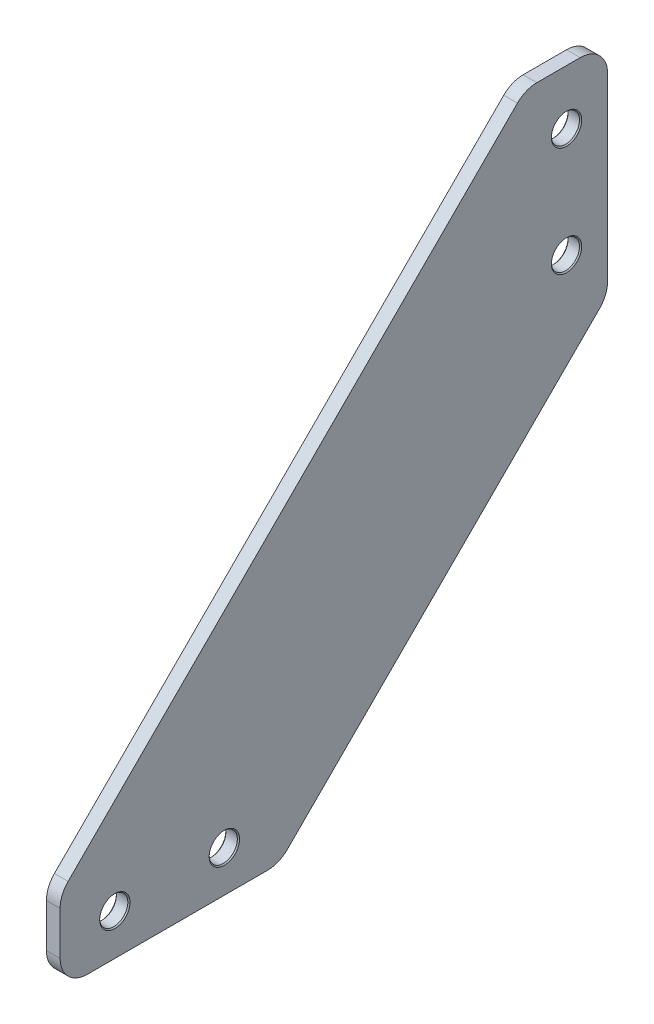
ISO-10303-21;
HEADER;
FILE_DESCRIPTION(('STEP AP214'),'2;1');
FILE_NAME('part.step','',(''),(''),'','','');
FILE_SCHEMA(('AUTOMOTIVE_DESIGN { 1 0 10303 214 1 1 1 1 }'));
ENDSEC;
DATA;
#1=APPLICATION_CONTEXT('core data for automotive mechanical design processes');
#2=APPLICATION_PROTOCOL_DEFINITION('international standard','automotive_design',2000,#1);
#3=PRODUCT_CONTEXT('',#1,'mechanical');
#4=PRODUCT('Part','Part','',(#3));
#5=PRODUCT_RELATED_PRODUCT_CATEGORY('part','',(#4));
#6=PRODUCT_DEFINITION_FORMATION('','',#4);
#7=PRODUCT_DEFINITION_CONTEXT('part definition',#1,'design');
#8=PRODUCT_DEFINITION('design','',#6,#7);
#9=PRODUCT_DEFINITION_SHAPE('','',#8);
#10=(LENGTH_UNIT() NAMED_UNIT(*) SI_UNIT(.MILLI.,.METRE.));
#11=(NAMED_UNIT(*) PLANE_ANGLE_UNIT() SI_UNIT($,.RADIAN.));
#12=(NAMED_UNIT(*) SI_UNIT($,.STERADIAN.) SOLID_ANGLE_UNIT());
#13=UNCERTAINTY_MEASURE_WITH_UNIT(LENGTH_MEASURE(1.E-05),#10,'distance_accuracy_value','');
#14=(GEOMETRIC_REPRESENTATION_CONTEXT(3) GLOBAL_UNCERTAINTY_ASSIGNED_CONTEXT((#13)) GLOBAL_UNIT_ASSIGNED_CONTEXT((#10,
#11,#12)) REPRESENTATION_CONTEXT('',''));
#15=CARTESIAN_POINT('',(0.,0.,0.));
#16=DIRECTION('',(0.,0.,1.));
#17=DIRECTION('',(1.,0.,0.));
#18=AXIS2_PLACEMENT_3D('',#15,#16,#17);
#19=CARTESIAN_POINT('',(1.5875,76.2000000000003,0.));
#20=DIRECTION('',(0.,0.,1.));
#21=DIRECTION('',(0.,-1.,0.));
#22=AXIS2_PLACEMENT_3D('',#19,#20,#21);
#23=PLANE('',#22);
#24=DIRECTION('',(0.,1.,0.));
#25=VECTOR('',#24,1.);
#26=CARTESIAN_POINT('',(1.5875,76.2000000000003,0.));
#27=LINE('',#26,#25);
#28=CARTESIAN_POINT('',(1.5875,78.8302561210695,0.));
#29=VERTEX_POINT('',#28);
#30=CARTESIAN_POINT('',(1.5875,120.65,0.));
#31=VERTEX_POINT('',#30);
#32=EDGE_CURVE('E150',#29,#31,#27,.T.);
#33=ORIENTED_EDGE('',*,*,#32,.F.);
#34=DIRECTION('',(-1.,0.,0.));
#35=VECTOR('',#34,1.);
#36=CARTESIAN_POINT('',(1.5875,78.8302561210695,0.));
#37=LINE('',#36,#35);
#38=CARTESIAN_POINT('',(-1.5875,78.8302561210695,0.));
#39=VERTEX_POINT('',#38);
#40=EDGE_CURVE('E135',#29,#39,#37,.T.);
#41=ORIENTED_EDGE('',*,*,#40,.T.);
#42=DIRECTION('',(0.,1.,0.));
#43=VECTOR('',#42,1.);
#44=CARTESIAN_POINT('',(-1.5875,76.2000000000003,0.));
#45=LINE('',#44,#43);
#46=CARTESIAN_POINT('',(-1.5875,120.65,0.));
#47=VERTEX_POINT('',#46);
#48=EDGE_CURVE('E147',#39,#47,#45,.T.);
#49=ORIENTED_EDGE('',*,*,#48,.T.);
#50=DIRECTION('',(-1.,0.,0.));
#51=VECTOR('',#50,1.);
#52=CARTESIAN_POINT('',(1.5875,120.65,0.));
#53=LINE('',#52,#51);
#54=EDGE_CURVE('E152',#47,#31,#53,.F.);
#55=ORIENTED_EDGE('',*,*,#54,.T.);
#56=EDGE_LOOP('',(#33,#41,#49,#55));
#57=FACE_BOUND('',#56,.T.);
#58=ADVANCED_FACE('F39',(#57),#23,.F.);
#59=CARTESIAN_POINT('',(1.5875,127.,0.));
#60=DIRECTION('',(0.,-1.,0.));
#61=DIRECTION('',(0.,0.,-1.));
#62=AXIS2_PLACEMENT_3D('',#59,#60,#61);
#63=PLANE('',#62);
#64=DIRECTION('',(0.,0.,1.));
#65=VECTOR('',#64,1.);
#66=CARTESIAN_POINT('',(1.5875,127.,0.));
#67=LINE('',#66,#65);
#68=CARTESIAN_POINT('',(1.5875,127.,6.35));
#69=VERTEX_POINT('',#68);
#70=CARTESIAN_POINT('',(1.5875,127.,16.4197438789308));
#71=VERTEX_POINT('',#70);
#72=EDGE_CURVE('E608',#69,#71,#67,.T.);
#73=ORIENTED_EDGE('',*,*,#72,.F.);
#74=DIRECTION('',(-1.,0.,0.));
#75=VECTOR('',#74,1.);
#76=CARTESIAN_POINT('',(1.5875,127.,6.35));
#77=LINE('',#76,#75);
#78=CARTESIAN_POINT('',(-1.5875,127.,6.35));
#79=VERTEX_POINT('',#78);
#80=EDGE_CURVE('E199',#69,#79,#77,.T.);
#81=ORIENTED_EDGE('',*,*,#80,.T.);
#82=DIRECTION('',(0.,0.,1.));
#83=VECTOR('',#82,1.);
#84=CARTESIAN_POINT('',(-1.5875,127.,0.));
#85=LINE('',#84,#83);
#86=CARTESIAN_POINT('',(-1.5875,127.,16.4197438789308));
#87=VERTEX_POINT('',#86);
#88=EDGE_CURVE('E156',#79,#87,#85,.T.);
#89=ORIENTED_EDGE('',*,*,#88,.T.);
#90=DIRECTION('',(-1.,0.,0.));
#91=VECTOR('',#90,1.);
#92=CARTESIAN_POINT('',(1.5875,127.,16.4197438789308));
#93=LINE('',#92,#91);
#94=EDGE_CURVE('E197',#87,#71,#93,.F.);
#95=ORIENTED_EDGE('',*,*,#94,.T.);
#96=EDGE_LOOP('',(#73,#81,#89,#95));
#97=FACE_BOUND('',#96,.T.);
#98=ADVANCED_FACE('F285',(#97),#63,.F.);
#99=CARTESIAN_POINT('',(1.5875,127.,19.05));
#100=DIRECTION('',(0.,-0.707106781186546,-0.707106781186549));
#101=DIRECTION('',(0.,0.707106781186549,-0.707106781186546));
#102=AXIS2_PLACEMENT_3D('',#99,#100,#101);
#103=PLANE('',#102);
#104=DIRECTION('',(0.,-0.707106781186549,0.707106781186546));
#105=VECTOR('',#104,1.);
#106=CARTESIAN_POINT('',(1.5875,127.,19.05));
#107=LINE('',#106,#105);
#108=CARTESIAN_POINT('',(1.5875,125.140128060535,20.9098719394654));
#109=VERTEX_POINT('',#108);
#110=CARTESIAN_POINT('',(1.5875,20.9098719394654,125.140128060535));
#111=VERTEX_POINT('',#110);
#112=EDGE_CURVE('E602',#109,#111,#107,.T.);
#113=ORIENTED_EDGE('',*,*,#112,.F.);
#114=DIRECTION('',(-1.,0.,0.));
#115=VECTOR('',#114,1.);
#116=CARTESIAN_POINT('',(1.5875,125.140128060535,20.9098719394654));
#117=LINE('',#116,#115);
#118=CARTESIAN_POINT('',(-1.5875,125.140128060535,20.9098719394654));
#119=VERTEX_POINT('',#118);
#120=EDGE_CURVE('E204',#109,#119,#117,.T.);
#121=ORIENTED_EDGE('',*,*,#120,.T.);
#122=DIRECTION('',(0.,-0.707106781186549,0.707106781186546));
#123=VECTOR('',#122,1.);
#124=CARTESIAN_POINT('',(-1.5875,127.,19.05));
#125=LINE('',#124,#123);
#126=CARTESIAN_POINT('',(-1.5875,20.9098719394654,125.140128060535));
#127=VERTEX_POINT('',#126);
#128=EDGE_CURVE('E159',#119,#127,#125,.T.);
#129=ORIENTED_EDGE('',*,*,#128,.T.);
#130=DIRECTION('',(-1.,0.,0.));
#131=VECTOR('',#130,1.);
#132=CARTESIAN_POINT('',(1.5875,20.9098719394654,125.140128060535));
#133=LINE('',#132,#131);
#134=EDGE_CURVE('E202',#127,#111,#133,.F.);
#135=ORIENTED_EDGE('',*,*,#134,.T.);
#136=EDGE_LOOP('',(#113,#121,#129,#135));
#137=FACE_BOUND('',#136,.T.);
#138=ADVANCED_FACE('F290',(#137),#103,.F.);
#139=CARTESIAN_POINT('',(1.5875,19.05,127.));
#140=DIRECTION('',(0.,0.,-1.));
#141=DIRECTION('',(-1.,0.,0.));
#142=AXIS2_PLACEMENT_3D('',#139,#140,#141);
#143=PLANE('',#142);
#144=DIRECTION('',(0.,-1.,0.));
#145=VECTOR('',#144,1.);
#146=CARTESIAN_POINT('',(1.5875,19.05,127.));
#147=LINE('',#146,#145);
#148=CARTESIAN_POINT('',(1.5875,16.4197438789308,127.));
#149=VERTEX_POINT('',#148);
#150=CARTESIAN_POINT('',(1.5875,6.35,127.));
#151=VERTEX_POINT('',#150);
#152=EDGE_CURVE('E607',#149,#151,#147,.T.);
#153=ORIENTED_EDGE('',*,*,#152,.F.);
#154=DIRECTION('',(-1.,0.,0.));
#155=VECTOR('',#154,1.);
#156=CARTESIAN_POINT('',(1.5875,16.4197438789308,127.));
#157=LINE('',#156,#155);
#158=CARTESIAN_POINT('',(-1.5875,16.4197438789308,127.));
#159=VERTEX_POINT('',#158);
#160=EDGE_CURVE('E209',#149,#159,#157,.T.);
#161=ORIENTED_EDGE('',*,*,#160,.T.);
#162=DIRECTION('',(0.,-1.,0.));
#163=VECTOR('',#162,1.);
#164=CARTESIAN_POINT('',(-1.5875,19.05,127.));
#165=LINE('',#164,#163);
#166=CARTESIAN_POINT('',(-1.5875,6.35,127.));
#167=VERTEX_POINT('',#166);
#168=EDGE_CURVE('E167',#159,#167,#165,.T.);
#169=ORIENTED_EDGE('',*,*,#168,.T.);
#170=DIRECTION('',(-1.,0.,0.));
#171=VECTOR('',#170,1.);
#172=CARTESIAN_POINT('',(1.5875,6.35,127.));
#173=LINE('',#172,#171);
#174=EDGE_CURVE('E207',#167,#151,#173,.F.);
#175=ORIENTED_EDGE('',*,*,#174,.T.);
#176=EDGE_LOOP('',(#153,#161,#169,#175));
#177=FACE_BOUND('',#176,.T.);
#178=ADVANCED_FACE('F471',(#177),#143,.F.);
#179=CARTESIAN_POINT('',(1.5875,0.,127.));
#180=DIRECTION('',(0.,1.,0.));
#181=DIRECTION('',(0.,0.,1.));
#182=AXIS2_PLACEMENT_3D('',#179,#180,#181);
#183=PLANE('',#182);
#184=DIRECTION('',(0.,0.,-1.));
#185=VECTOR('',#184,1.);
#186=CARTESIAN_POINT('',(-1.5875,0.,127.));
#187=LINE('',#186,#185);
#188=CARTESIAN_POINT('',(-1.5875,0.,120.65));
#189=VERTEX_POINT('',#188);
#190=CARTESIAN_POINT('',(-1.5875,0.,78.8302561210692));
#191=VERTEX_POINT('',#190);
#192=EDGE_CURVE('E170',#189,#191,#187,.T.);
#193=ORIENTED_EDGE('',*,*,#192,.T.);
#194=DIRECTION('',(-1.,0.,0.));
#195=VECTOR('',#194,1.);
#196=CARTESIAN_POINT('',(1.5875,0.,78.8302561210692));
#197=LINE('',#196,#195);
#198=CARTESIAN_POINT('',(1.5875,0.,78.8302561210692));
#199=VERTEX_POINT('',#198);
#200=EDGE_CURVE('E55',#191,#199,#197,.F.);
#201=ORIENTED_EDGE('',*,*,#200,.T.);
#202=DIRECTION('',(0.,0.,-1.));
#203=VECTOR('',#202,1.);
#204=CARTESIAN_POINT('',(1.5875,0.,127.));
#205=LINE('',#204,#203);
#206=CARTESIAN_POINT('',(1.5875,0.,120.65));
#207=VERTEX_POINT('',#206);
#208=EDGE_CURVE('E620',#207,#199,#205,.T.);
#209=ORIENTED_EDGE('',*,*,#208,.F.);
#210=DIRECTION('',(-1.,0.,0.));
#211=VECTOR('',#210,1.);
#212=CARTESIAN_POINT('',(1.5875,0.,120.65));
#213=LINE('',#212,#211);
#214=EDGE_CURVE('E212',#207,#189,#213,.T.);
#215=ORIENTED_EDGE('',*,*,#214,.T.);
#216=EDGE_LOOP('',(#193,#201,#209,#215));
#217=FACE_BOUND('',#216,.T.);
#218=ADVANCED_FACE('F461',(#217),#183,.F.);
#219=CARTESIAN_POINT('',(1.5875,0.,76.2));
#220=DIRECTION('',(0.,0.707106781186546,0.707106781186549));
#221=DIRECTION('',(0.,-0.707106781186549,0.707106781186546));
#222=AXIS2_PLACEMENT_3D('',#219,#220,#221);
#223=PLANE('',#222);
#224=DIRECTION('',(0.,0.707106781186549,-0.707106781186546));
#225=VECTOR('',#224,1.);
#226=CARTESIAN_POINT('',(-1.5875,0.,76.2));
#227=LINE('',#226,#225);
#228=CARTESIAN_POINT('',(-1.5875,1.85987193946543,74.3401280605346));
#229=VERTEX_POINT('',#228);
#230=CARTESIAN_POINT('',(-1.5875,74.3401280605349,1.85987193946542));
#231=VERTEX_POINT('',#230);
#232=EDGE_CURVE('E172',#229,#231,#227,.T.);
#233=ORIENTED_EDGE('',*,*,#232,.T.);
#234=DIRECTION('',(-1.,0.,0.));
#235=VECTOR('',#234,1.);
#236=CARTESIAN_POINT('',(1.5875,74.3401280605349,1.85987193946542));
#237=LINE('',#236,#235);
#238=CARTESIAN_POINT('',(1.5875,74.3401280605349,1.85987193946542));
#239=VERTEX_POINT('',#238);
#240=EDGE_CURVE('E136',#231,#239,#237,.F.);
#241=ORIENTED_EDGE('',*,*,#240,.T.);
#242=DIRECTION('',(0.,0.707106781186549,-0.707106781186546));
#243=VECTOR('',#242,1.);
#244=CARTESIAN_POINT('',(1.5875,0.,76.2));
#245=LINE('',#244,#243);
#246=CARTESIAN_POINT('',(1.5875,1.85987193946543,74.3401280605346));
#247=VERTEX_POINT('',#246);
#248=EDGE_CURVE('E162',#247,#239,#245,.T.);
#249=ORIENTED_EDGE('',*,*,#248,.F.);
#250=DIRECTION('',(-1.,0.,0.));
#251=VECTOR('',#250,1.);
#252=CARTESIAN_POINT('',(1.5875,1.85987193946543,74.3401280605346));
#253=LINE('',#252,#251);
#254=EDGE_CURVE('E141',#247,#229,#253,.T.);
#255=ORIENTED_EDGE('',*,*,#254,.T.);
#256=EDGE_LOOP('',(#233,#241,#249,#255));
#257=FACE_BOUND('',#256,.T.);
#258=ADVANCED_FACE('F279',(#257),#223,.F.);
#259=CARTESIAN_POINT('',(1.5875,0.,0.));
#260=DIRECTION('',(1.,0.,0.));
#261=DIRECTION('',(0.,0.,-1.));
#262=AXIS2_PLACEMENT_3D('',#259,#260,#261);
#263=PLANE('',#262);
#264=CARTESIAN_POINT('',(1.5875,114.3,9.525));
#265=DIRECTION('',(1.,0.,0.));
#266=DIRECTION('',(0.,0.,-1.));
#267=AXIS2_PLACEMENT_3D('',#264,#265,#266);
#268=CIRCLE('',#267,3.51790000000002);
#269=CARTESIAN_POINT('',(1.5875,114.3,6.00709999999998));
#270=VERTEX_POINT('',#269);
#271=EDGE_CURVE('E231',#270,#270,#268,.F.);
#272=ORIENTED_EDGE('',*,*,#271,.T.);
#273=EDGE_LOOP('',(#272));
#274=FACE_BOUND('',#273,.T.);
#275=CARTESIAN_POINT('',(1.5875,88.9000000000005,9.525));
#276=DIRECTION('',(1.,0.,0.));
#277=DIRECTION('',(0.,0.,-1.));
#278=AXIS2_PLACEMENT_3D('',#275,#276,#277);
#279=CIRCLE('',#278,3.51790000000002);
#280=CARTESIAN_POINT('',(1.5875,88.9000000000005,6.00709999999998));
#281=VERTEX_POINT('',#280);
#282=EDGE_CURVE('E228',#281,#281,#279,.F.);
#283=ORIENTED_EDGE('',*,*,#282,.T.);
#284=EDGE_LOOP('',(#283));
#285=FACE_BOUND('',#284,.T.);
#286=CARTESIAN_POINT('',(1.5875,9.525,114.3));
#287=DIRECTION('',(1.,0.,0.));
#288=DIRECTION('',(0.,0.,-1.));
#289=AXIS2_PLACEMENT_3D('',#286,#287,#288);
#290=CIRCLE('',#289,3.51790000000002);
#291=CARTESIAN_POINT('',(1.5875,9.525,110.7821));
#292=VERTEX_POINT('',#291);
#293=EDGE_CURVE('E225',#292,#292,#290,.F.);
#294=ORIENTED_EDGE('',*,*,#293,.T.);
#295=EDGE_LOOP('',(#294));
#296=FACE_BOUND('',#295,.T.);
#297=CARTESIAN_POINT('',(1.5875,9.525,88.9));
#298=DIRECTION('',(1.,0.,0.));
#299=DIRECTION('',(0.,0.,-1.));
#300=AXIS2_PLACEMENT_3D('',#297,#298,#299);
#301=CIRCLE('',#300,3.51790000000002);
#302=CARTESIAN_POINT('',(1.5875,9.525,85.3821));
#303=VERTEX_POINT('',#302);
#304=EDGE_CURVE('E222',#303,#303,#301,.F.);
#305=ORIENTED_EDGE('',*,*,#304,.T.);
#306=EDGE_LOOP('',(#305));
#307=FACE_BOUND('',#306,.T.);
#308=ORIENTED_EDGE('',*,*,#248,.T.);
#309=CARTESIAN_POINT('',(1.5875,78.8302561210695,6.35));
#310=DIRECTION('',(1.,0.,0.));
#311=DIRECTION('',(0.,0.,-1.));
#312=AXIS2_PLACEMENT_3D('',#309,#310,#311);
#313=CIRCLE('',#312,6.35);
#314=EDGE_CURVE('E195',#239,#29,#313,.T.);
#315=ORIENTED_EDGE('',*,*,#314,.T.);
#316=ORIENTED_EDGE('',*,*,#32,.T.);
#317=CARTESIAN_POINT('',(1.5875,120.65,6.35));
#318=DIRECTION('',(1.,0.,0.));
#319=DIRECTION('',(0.,0.,-1.));
#320=AXIS2_PLACEMENT_3D('',#317,#318,#319);
#321=CIRCLE('',#320,6.35);
#322=EDGE_CURVE('E193',#31,#69,#321,.T.);
#323=ORIENTED_EDGE('',*,*,#322,.T.);
#324=ORIENTED_EDGE('',*,*,#72,.T.);
#325=CARTESIAN_POINT('',(1.5875,120.65,16.4197438789308));
#326=DIRECTION('',(1.,0.,0.));
#327=DIRECTION('',(0.,0.,-1.));
#328=AXIS2_PLACEMENT_3D('',#325,#326,#327);
#329=CIRCLE('',#328,6.35);
#330=EDGE_CURVE('E191',#71,#109,#329,.T.);
#331=ORIENTED_EDGE('',*,*,#330,.T.);
#332=ORIENTED_EDGE('',*,*,#112,.T.);
#333=CARTESIAN_POINT('',(1.5875,16.4197438789308,120.65));
#334=DIRECTION('',(1.,0.,0.));
#335=DIRECTION('',(0.,0.,-1.));
#336=AXIS2_PLACEMENT_3D('',#333,#334,#335);
#337=CIRCLE('',#336,6.35);
#338=EDGE_CURVE('E189',#111,#149,#337,.T.);
#339=ORIENTED_EDGE('',*,*,#338,.T.);
#340=ORIENTED_EDGE('',*,*,#152,.T.);
#341=CARTESIAN_POINT('',(1.5875,6.35,120.65));
#342=DIRECTION('',(1.,0.,0.));
#343=DIRECTION('',(0.,0.,-1.));
#344=AXIS2_PLACEMENT_3D('',#341,#342,#343);
#345=CIRCLE('',#344,6.35);
#346=EDGE_CURVE('E62',#151,#207,#345,.T.);
#347=ORIENTED_EDGE('',*,*,#346,.T.);
#348=ORIENTED_EDGE('',*,*,#208,.T.);
#349=CARTESIAN_POINT('',(1.5875,6.35,78.8302561210692));
#350=DIRECTION('',(1.,0.,0.));
#351=DIRECTION('',(0.,0.,-1.));
#352=AXIS2_PLACEMENT_3D('',#349,#350,#351);
#353=CIRCLE('',#352,6.35);
#354=EDGE_CURVE('E187',#199,#247,#353,.T.);
#355=ORIENTED_EDGE('',*,*,#354,.T.);
#356=EDGE_LOOP('',(#308,#315,#316,#323,#324,#331,#332,#339,#340,#347,#348,#355));
#357=FACE_BOUND('',#356,.T.);
#358=ADVANCED_FACE('F269',(#274,#285,#296,#307,#357),#263,.T.);
#359=CARTESIAN_POINT('',(-1.5875,0.,0.));
#360=DIRECTION('',(1.,0.,0.));
#361=DIRECTION('',(0.,0.,-1.));
#362=AXIS2_PLACEMENT_3D('',#359,#360,#361);
#363=PLANE('',#362);
#364=CARTESIAN_POINT('',(-1.5875,114.3,9.525));
#365=DIRECTION('',(1.,0.,0.));
#366=DIRECTION('',(0.,0.,-1.));
#367=AXIS2_PLACEMENT_3D('',#364,#365,#366);
#368=CIRCLE('',#367,3.5179);
#369=CARTESIAN_POINT('',(-1.5875,114.3,6.00709999999999));
#370=VERTEX_POINT('',#369);
#371=EDGE_CURVE('E243',#370,#370,#368,.T.);
#372=ORIENTED_EDGE('',*,*,#371,.T.);
#373=EDGE_LOOP('',(#372));
#374=FACE_BOUND('',#373,.T.);
#375=CARTESIAN_POINT('',(-1.5875,88.9000000000005,9.525));
#376=DIRECTION('',(1.,0.,0.));
#377=DIRECTION('',(0.,0.,-1.));
#378=AXIS2_PLACEMENT_3D('',#375,#376,#377);
#379=CIRCLE('',#378,3.5179);
#380=CARTESIAN_POINT('',(-1.5875,88.9000000000005,6.00709999999999));
#381=VERTEX_POINT('',#380);
#382=EDGE_CURVE('E240',#381,#381,#379,.T.);
#383=ORIENTED_EDGE('',*,*,#382,.T.);
#384=EDGE_LOOP('',(#383));
#385=FACE_BOUND('',#384,.T.);
#386=CARTESIAN_POINT('',(-1.5875,9.525,114.3));
#387=DIRECTION('',(1.,0.,0.));
#388=DIRECTION('',(0.,0.,-1.));
#389=AXIS2_PLACEMENT_3D('',#386,#387,#388);
#390=CIRCLE('',#389,3.51789999999998);
#391=CARTESIAN_POINT('',(-1.5875,9.525,110.7821));
#392=VERTEX_POINT('',#391);
#393=EDGE_CURVE('E237',#392,#392,#390,.T.);
#394=ORIENTED_EDGE('',*,*,#393,.T.);
#395=EDGE_LOOP('',(#394));
#396=FACE_BOUND('',#395,.T.);
#397=CARTESIAN_POINT('',(-1.5875,9.525,88.9));
#398=DIRECTION('',(1.,0.,0.));
#399=DIRECTION('',(0.,0.,-1.));
#400=AXIS2_PLACEMENT_3D('',#397,#398,#399);
#401=CIRCLE('',#400,3.51789999999998);
#402=CARTESIAN_POINT('',(-1.5875,9.525,85.3821));
#403=VERTEX_POINT('',#402);
#404=EDGE_CURVE('E234',#403,#403,#401,.T.);
#405=ORIENTED_EDGE('',*,*,#404,.T.);
#406=EDGE_LOOP('',(#405));
#407=FACE_BOUND('',#406,.T.);
#408=ORIENTED_EDGE('',*,*,#48,.F.);
#409=CARTESIAN_POINT('',(-1.5875,78.8302561210695,6.35));
#410=DIRECTION('',(1.,0.,0.));
#411=DIRECTION('',(0.,0.,-1.));
#412=AXIS2_PLACEMENT_3D('',#409,#410,#411);
#413=CIRCLE('',#412,6.35);
#414=EDGE_CURVE('E131',#39,#231,#413,.F.);
#415=ORIENTED_EDGE('',*,*,#414,.T.);
#416=ORIENTED_EDGE('',*,*,#232,.F.);
#417=CARTESIAN_POINT('',(-1.5875,6.35,78.8302561210692));
#418=DIRECTION('',(1.,0.,0.));
#419=DIRECTION('',(0.,0.,-1.));
#420=AXIS2_PLACEMENT_3D('',#417,#418,#419);
#421=CIRCLE('',#420,6.35);
#422=EDGE_CURVE('E176',#229,#191,#421,.F.);
#423=ORIENTED_EDGE('',*,*,#422,.T.);
#424=ORIENTED_EDGE('',*,*,#192,.F.);
#425=CARTESIAN_POINT('',(-1.5875,6.35,120.65));
#426=DIRECTION('',(1.,0.,0.));
#427=DIRECTION('',(0.,0.,-1.));
#428=AXIS2_PLACEMENT_3D('',#425,#426,#427);
#429=CIRCLE('',#428,6.35);
#430=EDGE_CURVE('E151',#189,#167,#429,.F.);
#431=ORIENTED_EDGE('',*,*,#430,.T.);
#432=ORIENTED_EDGE('',*,*,#168,.F.);
#433=CARTESIAN_POINT('',(-1.5875,16.4197438789308,120.65));
#434=DIRECTION('',(1.,0.,0.));
#435=DIRECTION('',(0.,0.,-1.));
#436=AXIS2_PLACEMENT_3D('',#433,#434,#435);
#437=CIRCLE('',#436,6.35);
#438=EDGE_CURVE('E178',#159,#127,#437,.F.);
#439=ORIENTED_EDGE('',*,*,#438,.T.);
#440=ORIENTED_EDGE('',*,*,#128,.F.);
#441=CARTESIAN_POINT('',(-1.5875,120.65,16.4197438789308));
#442=DIRECTION('',(1.,0.,0.));
#443=DIRECTION('',(0.,0.,-1.));
#444=AXIS2_PLACEMENT_3D('',#441,#442,#443);
#445=CIRCLE('',#444,6.35);
#446=EDGE_CURVE('E180',#119,#87,#445,.F.);
#447=ORIENTED_EDGE('',*,*,#446,.T.);
#448=ORIENTED_EDGE('',*,*,#88,.F.);
#449=CARTESIAN_POINT('',(-1.5875,120.65,6.35));
#450=DIRECTION('',(1.,0.,0.));
#451=DIRECTION('',(0.,0.,-1.));
#452=AXIS2_PLACEMENT_3D('',#449,#450,#451);
#453=CIRCLE('',#452,6.35);
#454=EDGE_CURVE('E142',#79,#47,#453,.F.);
#455=ORIENTED_EDGE('',*,*,#454,.T.);
#456=EDGE_LOOP('',(#408,#415,#416,#423,#424,#431,#432,#439,#440,#447,#448,#455));
#457=FACE_BOUND('',#456,.T.);
#458=ADVANCED_FACE('F154',(#374,#385,#396,#407,#457),#363,.F.);
#459=CARTESIAN_POINT('',(1.5875,114.3,9.525));
#460=DIRECTION('',(1.,0.,0.));
#461=DIRECTION('',(0.,0.,-1.));
#462=AXIS2_PLACEMENT_3D('',#459,#460,#461);
#463=CYLINDRICAL_SURFACE('',#462,3.2639);
#464=CARTESIAN_POINT('',(1.33349999999997,114.3,9.525));
#465=DIRECTION('',(1.,0.,0.));
#466=DIRECTION('',(0.,0.,-1.));
#467=AXIS2_PLACEMENT_3D('',#464,#465,#466);
#468=CIRCLE('',#467,3.2639);
#469=CARTESIAN_POINT('',(1.33349999999997,114.3,6.2611));
#470=VERTEX_POINT('',#469);
#471=EDGE_CURVE('E219',#470,#470,#468,.T.);
#472=ORIENTED_EDGE('',*,*,#471,.T.);
#473=EDGE_LOOP('',(#472));
#474=FACE_BOUND('',#473,.T.);
#475=CARTESIAN_POINT('',(-1.33349999999999,114.3,9.525));
#476=DIRECTION('',(1.,0.,0.));
#477=DIRECTION('',(0.,0.,-1.));
#478=AXIS2_PLACEMENT_3D('',#475,#476,#477);
#479=CIRCLE('',#478,3.2639);
#480=CARTESIAN_POINT('',(-1.33349999999999,114.3,6.2611));
#481=VERTEX_POINT('',#480);
#482=EDGE_CURVE('E216',#481,#481,#479,.F.);
#483=ORIENTED_EDGE('',*,*,#482,.T.);
#484=EDGE_LOOP('',(#483));
#485=FACE_BOUND('',#484,.T.);
#486=ADVANCED_FACE('F268',(#474,#485),#463,.F.);
#487=CARTESIAN_POINT('',(1.5875,88.9000000000005,9.525));
#488=DIRECTION('',(1.,0.,0.));
#489=DIRECTION('',(0.,0.,-1.));
#490=AXIS2_PLACEMENT_3D('',#487,#488,#489);
#491=CYLINDRICAL_SURFACE('',#490,3.2639);
#492=CARTESIAN_POINT('',(1.33349999999997,88.9000000000005,9.525));
#493=DIRECTION('',(1.,0.,0.));
#494=DIRECTION('',(0.,0.,-1.));
#495=AXIS2_PLACEMENT_3D('',#492,#493,#494);
#496=CIRCLE('',#495,3.2639);
#497=CARTESIAN_POINT('',(1.33349999999997,88.9000000000005,6.2611));
#498=VERTEX_POINT('',#497);
#499=EDGE_CURVE('E249',#498,#498,#496,.T.);
#500=ORIENTED_EDGE('',*,*,#499,.T.);
#501=EDGE_LOOP('',(#500));
#502=FACE_BOUND('',#501,.T.);
#503=CARTESIAN_POINT('',(-1.33349999999999,88.9000000000005,9.525));
#504=DIRECTION('',(1.,0.,0.));
#505=DIRECTION('',(0.,0.,-1.));
#506=AXIS2_PLACEMENT_3D('',#503,#504,#505);
#507=CIRCLE('',#506,3.2639);
#508=CARTESIAN_POINT('',(-1.33349999999999,88.9000000000005,6.2611));
#509=VERTEX_POINT('',#508);
#510=EDGE_CURVE('E246',#509,#509,#507,.F.);
#511=ORIENTED_EDGE('',*,*,#510,.T.);
#512=EDGE_LOOP('',(#511));
#513=FACE_BOUND('',#512,.T.);
#514=ADVANCED_FACE('F276',(#502,#513),#491,.F.);
#515=CARTESIAN_POINT('',(1.5875,9.525,88.9));
#516=DIRECTION('',(1.,0.,0.));
#517=DIRECTION('',(0.,0.,-1.));
#518=AXIS2_PLACEMENT_3D('',#515,#516,#517);
#519=CYLINDRICAL_SURFACE('',#518,3.2639);
#520=CARTESIAN_POINT('',(1.33349999999997,9.525,88.9));
#521=DIRECTION('',(1.,0.,0.));
#522=DIRECTION('',(0.,0.,-1.));
#523=AXIS2_PLACEMENT_3D('',#520,#521,#522);
#524=CIRCLE('',#523,3.2639);
#525=CARTESIAN_POINT('',(1.33349999999997,9.525,85.6361));
#526=VERTEX_POINT('',#525);
#527=EDGE_CURVE('E11',#526,#526,#524,.T.);
#528=ORIENTED_EDGE('',*,*,#527,.T.);
#529=EDGE_LOOP('',(#528));
#530=FACE_BOUND('',#529,.T.);
#531=CARTESIAN_POINT('',(-1.33350000000003,9.525,88.9));
#532=DIRECTION('',(1.,0.,0.));
#533=DIRECTION('',(0.,0.,-1.));
#534=AXIS2_PLACEMENT_3D('',#531,#532,#533);
#535=CIRCLE('',#534,3.2639);
#536=CARTESIAN_POINT('',(-1.33350000000003,9.525,85.6361));
#537=VERTEX_POINT('',#536);
#538=EDGE_CURVE('E48',#537,#537,#535,.F.);
#539=ORIENTED_EDGE('',*,*,#538,.T.);
#540=EDGE_LOOP('',(#539));
#541=FACE_BOUND('',#540,.T.);
#542=ADVANCED_FACE('F260',(#530,#541),#519,.F.);
#543=CARTESIAN_POINT('',(1.5875,9.525,114.3));
#544=DIRECTION('',(1.,0.,0.));
#545=DIRECTION('',(0.,0.,-1.));
#546=AXIS2_PLACEMENT_3D('',#543,#544,#545);
#547=CYLINDRICAL_SURFACE('',#546,3.2639);
#548=CARTESIAN_POINT('',(1.33349999999997,9.525,114.3));
#549=DIRECTION('',(1.,0.,0.));
#550=DIRECTION('',(0.,0.,-1.));
#551=AXIS2_PLACEMENT_3D('',#548,#549,#550);
#552=CIRCLE('',#551,3.2639);
#553=CARTESIAN_POINT('',(1.33349999999997,9.525,111.0361));
#554=VERTEX_POINT('',#553);
#555=EDGE_CURVE('E255',#554,#554,#552,.T.);
#556=ORIENTED_EDGE('',*,*,#555,.T.);
#557=EDGE_LOOP('',(#556));
#558=FACE_BOUND('',#557,.T.);
#559=CARTESIAN_POINT('',(-1.33350000000003,9.525,114.3));
#560=DIRECTION('',(1.,0.,0.));
#561=DIRECTION('',(0.,0.,-1.));
#562=AXIS2_PLACEMENT_3D('',#559,#560,#561);
#563=CIRCLE('',#562,3.2639);
#564=CARTESIAN_POINT('',(-1.33350000000003,9.525,111.0361));
#565=VERTEX_POINT('',#564);
#566=EDGE_CURVE('E252',#565,#565,#563,.F.);
#567=ORIENTED_EDGE('',*,*,#566,.T.);
#568=EDGE_LOOP('',(#567));
#569=FACE_BOUND('',#568,.T.);
#570=ADVANCED_FACE('F298',(#558,#569),#547,.F.);
#571=CARTESIAN_POINT('',(1.5875,78.8302561210695,6.35));
#572=DIRECTION('',(-1.,0.,0.));
#573=DIRECTION('',(0.,0.,1.));
#574=AXIS2_PLACEMENT_3D('',#571,#572,#573);
#575=CYLINDRICAL_SURFACE('',#574,6.35);
#576=ORIENTED_EDGE('',*,*,#314,.F.);
#577=ORIENTED_EDGE('',*,*,#240,.F.);
#578=ORIENTED_EDGE('',*,*,#414,.F.);
#579=ORIENTED_EDGE('',*,*,#40,.F.);
#580=EDGE_LOOP('',(#576,#577,#578,#579));
#581=FACE_BOUND('',#580,.T.);
#582=ADVANCED_FACE('F134',(#581),#575,.T.);
#583=CARTESIAN_POINT('',(1.5875,120.65,6.35));
#584=DIRECTION('',(-1.,0.,0.));
#585=DIRECTION('',(0.,0.,1.));
#586=AXIS2_PLACEMENT_3D('',#583,#584,#585);
#587=CYLINDRICAL_SURFACE('',#586,6.35);
#588=ORIENTED_EDGE('',*,*,#322,.F.);
#589=ORIENTED_EDGE('',*,*,#54,.F.);
#590=ORIENTED_EDGE('',*,*,#454,.F.);
#591=ORIENTED_EDGE('',*,*,#80,.F.);
#592=EDGE_LOOP('',(#588,#589,#590,#591));
#593=FACE_BOUND('',#592,.T.);
#594=ADVANCED_FACE('F297',(#593),#587,.T.);
#595=CARTESIAN_POINT('',(1.5875,120.65,16.4197438789308));
#596=DIRECTION('',(-1.,0.,0.));
#597=DIRECTION('',(0.,0.,1.));
#598=AXIS2_PLACEMENT_3D('',#595,#596,#597);
#599=CYLINDRICAL_SURFACE('',#598,6.35);
#600=ORIENTED_EDGE('',*,*,#330,.F.);
#601=ORIENTED_EDGE('',*,*,#94,.F.);
#602=ORIENTED_EDGE('',*,*,#446,.F.);
#603=ORIENTED_EDGE('',*,*,#120,.F.);
#604=EDGE_LOOP('',(#600,#601,#602,#603));
#605=FACE_BOUND('',#604,.T.);
#606=ADVANCED_FACE('F301',(#605),#599,.T.);
#607=CARTESIAN_POINT('',(1.5875,16.4197438789308,120.65));
#608=DIRECTION('',(-1.,0.,0.));
#609=DIRECTION('',(0.,0.,1.));
#610=AXIS2_PLACEMENT_3D('',#607,#608,#609);
#611=CYLINDRICAL_SURFACE('',#610,6.35);
#612=ORIENTED_EDGE('',*,*,#338,.F.);
#613=ORIENTED_EDGE('',*,*,#134,.F.);
#614=ORIENTED_EDGE('',*,*,#438,.F.);
#615=ORIENTED_EDGE('',*,*,#160,.F.);
#616=EDGE_LOOP('',(#612,#613,#614,#615));
#617=FACE_BOUND('',#616,.T.);
#618=ADVANCED_FACE('F305',(#617),#611,.T.);
#619=CARTESIAN_POINT('',(1.5875,6.35,78.8302561210692));
#620=DIRECTION('',(-1.,0.,0.));
#621=DIRECTION('',(0.,0.,1.));
#622=AXIS2_PLACEMENT_3D('',#619,#620,#621);
#623=CYLINDRICAL_SURFACE('',#622,6.35);
#624=ORIENTED_EDGE('',*,*,#354,.F.);
#625=ORIENTED_EDGE('',*,*,#200,.F.);
#626=ORIENTED_EDGE('',*,*,#422,.F.);
#627=ORIENTED_EDGE('',*,*,#254,.F.);
#628=EDGE_LOOP('',(#624,#625,#626,#627));
#629=FACE_BOUND('',#628,.T.);
#630=ADVANCED_FACE('F309',(#629),#623,.T.);
#631=CARTESIAN_POINT('',(1.5875,6.35,120.65));
#632=DIRECTION('',(-1.,0.,0.));
#633=DIRECTION('',(0.,0.,1.));
#634=AXIS2_PLACEMENT_3D('',#631,#632,#633);
#635=CYLINDRICAL_SURFACE('',#634,6.35);
#636=ORIENTED_EDGE('',*,*,#346,.F.);
#637=ORIENTED_EDGE('',*,*,#174,.F.);
#638=ORIENTED_EDGE('',*,*,#430,.F.);
#639=ORIENTED_EDGE('',*,*,#214,.F.);
#640=EDGE_LOOP('',(#636,#637,#638,#639));
#641=FACE_BOUND('',#640,.T.);
#642=ADVANCED_FACE('F313',(#641),#635,.T.);
#643=CARTESIAN_POINT('',(1.33349999999997,114.3,9.525));
#644=DIRECTION('',(1.,0.,0.));
#645=DIRECTION('',(0.,0.,-1.));
#646=AXIS2_PLACEMENT_3D('',#643,#644,#645);
#647=CONICAL_SURFACE('',#646,3.2639,0.785398163397425);
#648=ORIENTED_EDGE('',*,*,#271,.F.);
#649=EDGE_LOOP('',(#648));
#650=FACE_BOUND('',#649,.T.);
#651=ORIENTED_EDGE('',*,*,#471,.F.);
#652=EDGE_LOOP('',(#651));
#653=FACE_BOUND('',#652,.T.);
#654=ADVANCED_FACE('F317',(#650,#653),#647,.F.);
#655=CARTESIAN_POINT('',(-1.5875,114.3,9.525));
#656=DIRECTION('',(-1.,0.,0.));
#657=DIRECTION('',(0.,0.,1.));
#658=AXIS2_PLACEMENT_3D('',#655,#656,#657);
#659=CONICAL_SURFACE('',#658,3.5179,0.785398163397432);
#660=ORIENTED_EDGE('',*,*,#482,.F.);
#661=EDGE_LOOP('',(#660));
#662=FACE_BOUND('',#661,.T.);
#663=ORIENTED_EDGE('',*,*,#371,.F.);
#664=EDGE_LOOP('',(#663));
#665=FACE_BOUND('',#664,.T.);
#666=ADVANCED_FACE('F325',(#662,#665),#659,.F.);
#667=CARTESIAN_POINT('',(1.33349999999997,88.9000000000005,9.525));
#668=DIRECTION('',(1.,0.,0.));
#669=DIRECTION('',(0.,0.,-1.));
#670=AXIS2_PLACEMENT_3D('',#667,#668,#669);
#671=CONICAL_SURFACE('',#670,3.2639,0.785398163397425);
#672=ORIENTED_EDGE('',*,*,#282,.F.);
#673=EDGE_LOOP('',(#672));
#674=FACE_BOUND('',#673,.T.);
#675=ORIENTED_EDGE('',*,*,#499,.F.);
#676=EDGE_LOOP('',(#675));
#677=FACE_BOUND('',#676,.T.);
#678=ADVANCED_FACE('F332',(#674,#677),#671,.F.);
#679=CARTESIAN_POINT('',(-1.5875,88.9000000000005,9.525));
#680=DIRECTION('',(-1.,0.,0.));
#681=DIRECTION('',(0.,0.,1.));
#682=AXIS2_PLACEMENT_3D('',#679,#680,#681);
#683=CONICAL_SURFACE('',#682,3.5179,0.785398163397432);
#684=ORIENTED_EDGE('',*,*,#510,.F.);
#685=EDGE_LOOP('',(#684));
#686=FACE_BOUND('',#685,.T.);
#687=ORIENTED_EDGE('',*,*,#382,.F.);
#688=EDGE_LOOP('',(#687));
#689=FACE_BOUND('',#688,.T.);
#690=ADVANCED_FACE('F339',(#686,#689),#683,.F.);
#691=CARTESIAN_POINT('',(1.33349999999997,9.525,114.3));
#692=DIRECTION('',(1.,0.,0.));
#693=DIRECTION('',(0.,0.,-1.));
#694=AXIS2_PLACEMENT_3D('',#691,#692,#693);
#695=CONICAL_SURFACE('',#694,3.2639,0.785398163397425);
#696=ORIENTED_EDGE('',*,*,#293,.F.);
#697=EDGE_LOOP('',(#696));
#698=FACE_BOUND('',#697,.T.);
#699=ORIENTED_EDGE('',*,*,#555,.F.);
#700=EDGE_LOOP('',(#699));
#701=FACE_BOUND('',#700,.T.);
#702=ADVANCED_FACE('F346',(#698,#701),#695,.F.);
#703=CARTESIAN_POINT('',(-1.5875,9.525,114.3));
#704=DIRECTION('',(-1.,0.,0.));
#705=DIRECTION('',(0.,0.,1.));
#706=AXIS2_PLACEMENT_3D('',#703,#704,#705);
#707=CONICAL_SURFACE('',#706,3.51789999999998,0.785398163397453);
#708=ORIENTED_EDGE('',*,*,#566,.F.);
#709=EDGE_LOOP('',(#708));
#710=FACE_BOUND('',#709,.T.);
#711=ORIENTED_EDGE('',*,*,#393,.F.);
#712=EDGE_LOOP('',(#711));
#713=FACE_BOUND('',#712,.T.);
#714=ADVANCED_FACE('F353',(#710,#713),#707,.F.);
#715=CARTESIAN_POINT('',(1.33349999999997,9.525,88.9));
#716=DIRECTION('',(1.,0.,0.));
#717=DIRECTION('',(0.,0.,-1.));
#718=AXIS2_PLACEMENT_3D('',#715,#716,#717);
#719=CONICAL_SURFACE('',#718,3.2639,0.785398163397425);
#720=ORIENTED_EDGE('',*,*,#304,.F.);
#721=EDGE_LOOP('',(#720));
#722=FACE_BOUND('',#721,.T.);
#723=ORIENTED_EDGE('',*,*,#527,.F.);
#724=EDGE_LOOP('',(#723));
#725=FACE_BOUND('',#724,.T.);
#726=ADVANCED_FACE('F264',(#722,#725),#719,.F.);
#727=CARTESIAN_POINT('',(-1.5875,9.525,88.9));
#728=DIRECTION('',(-1.,0.,0.));
#729=DIRECTION('',(0.,0.,1.));
#730=AXIS2_PLACEMENT_3D('',#727,#728,#729);
#731=CONICAL_SURFACE('',#730,3.51789999999998,0.785398163397453);
#732=ORIENTED_EDGE('',*,*,#538,.F.);
#733=EDGE_LOOP('',(#732));
#734=FACE_BOUND('',#733,.T.);
#735=ORIENTED_EDGE('',*,*,#404,.F.);
#736=EDGE_LOOP('',(#735));
#737=FACE_BOUND('',#736,.T.);
#738=ADVANCED_FACE('F42',(#734,#737),#731,.F.);
#739=CLOSED_SHELL('',(#58,#98,#138,#178,#218,#258,#358,#458,#486,#514,#542,#570,#582,#594,#606,
#618,#630,#642,#654,#666,#678,#690,#702,#714,#726,#738));
#740=MANIFOLD_SOLID_BREP('B2',#739);
#741=ADVANCED_BREP_SHAPE_REPRESENTATION('',(#18,#740),#14);
#742=SHAPE_DEFINITION_REPRESENTATION(#9,#741);
ENDSEC;
END-ISO-10303-21;
